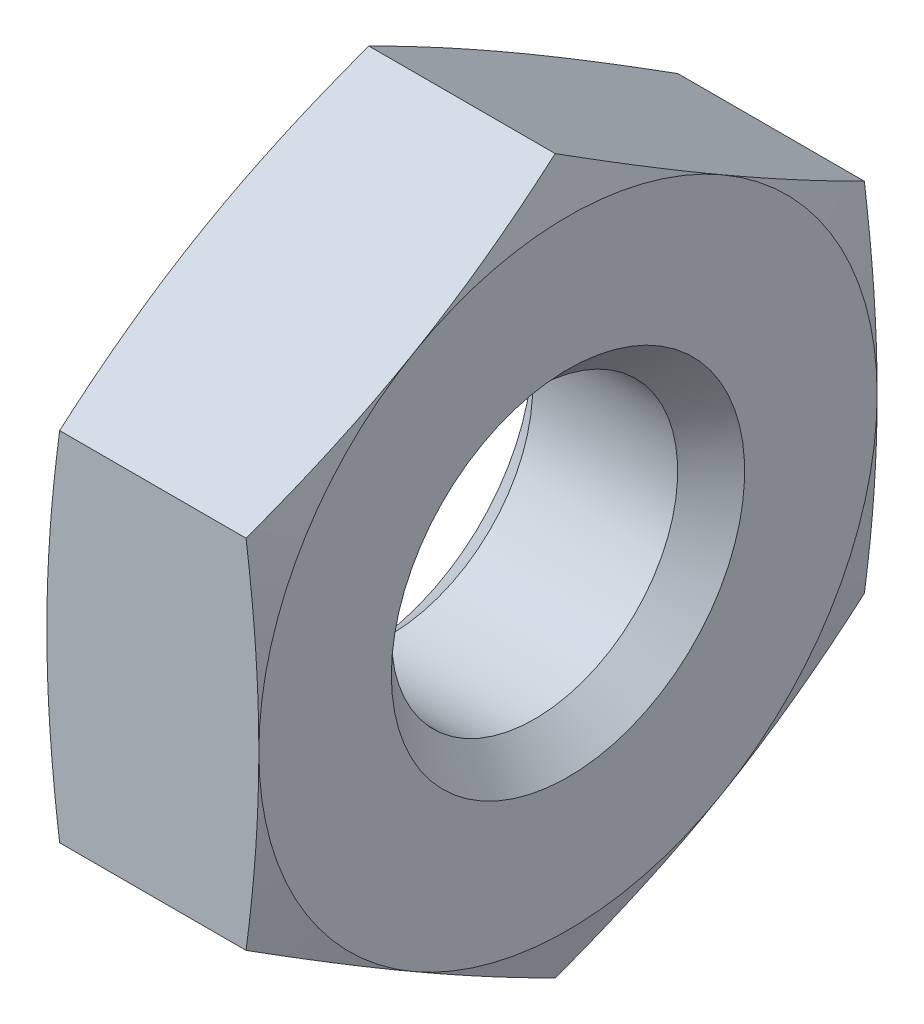
ISO-10303-21;
HEADER;
FILE_DESCRIPTION(('STEP AP214'),'2;1');
FILE_NAME('part.step','',(''),(''),'','','');
FILE_SCHEMA(('AUTOMOTIVE_DESIGN { 1 0 10303 214 1 1 1 1 }'));
ENDSEC;
DATA;
#1=APPLICATION_CONTEXT('core data for automotive mechanical design processes');
#2=APPLICATION_PROTOCOL_DEFINITION('international standard','automotive_design',2000,#1);
#3=PRODUCT_CONTEXT('',#1,'mechanical');
#4=PRODUCT('Part','Part','',(#3));
#5=PRODUCT_RELATED_PRODUCT_CATEGORY('part','',(#4));
#6=PRODUCT_DEFINITION_FORMATION('','',#4);
#7=PRODUCT_DEFINITION_CONTEXT('part definition',#1,'design');
#8=PRODUCT_DEFINITION('design','',#6,#7);
#9=PRODUCT_DEFINITION_SHAPE('','',#8);
#10=(LENGTH_UNIT() NAMED_UNIT(*) SI_UNIT(.MILLI.,.METRE.));
#11=(NAMED_UNIT(*) PLANE_ANGLE_UNIT() SI_UNIT($,.RADIAN.));
#12=(NAMED_UNIT(*) SI_UNIT($,.STERADIAN.) SOLID_ANGLE_UNIT());
#13=UNCERTAINTY_MEASURE_WITH_UNIT(LENGTH_MEASURE(1.E-05),#10,'distance_accuracy_value','');
#14=(GEOMETRIC_REPRESENTATION_CONTEXT(3) GLOBAL_UNCERTAINTY_ASSIGNED_CONTEXT((#13)) GLOBAL_UNIT_ASSIGNED_CONTEXT((#10,
#11,#12)) REPRESENTATION_CONTEXT('',''));
#15=CARTESIAN_POINT('',(0.,0.,0.));
#16=DIRECTION('',(0.,0.,1.));
#17=DIRECTION('',(1.,0.,0.));
#18=AXIS2_PLACEMENT_3D('',#15,#16,#17);
#19=CARTESIAN_POINT('',(0.56269330410532,0.,0.));
#20=DIRECTION('',(1.,0.,0.));
#21=DIRECTION('',(0.,0.,-1.));
#22=AXIS2_PLACEMENT_3D('',#19,#20,#21);
#23=CONICAL_SURFACE('',#22,5.6,1.30899693899576);
#24=CARTESIAN_POINT('',(0.780299643703765,-5.37263958975337,-3.5));
#25=CARTESIAN_POINT('',(0.744589233852441,-5.21354089147475,-3.5));
#26=CARTESIAN_POINT('',(0.70931171891034,-5.05434349000158,-3.5));
#27=CARTESIAN_POINT('',(0.639854512837468,-4.7357025881723,-3.5));
#28=CARTESIAN_POINT('',(0.605674868309391,-4.57625907766958,-3.5));
#29=CARTESIAN_POINT('',(0.538616504644134,-4.25693837005399,-3.5));
#30=CARTESIAN_POINT('',(0.505739058843958,-4.09706090420762,-3.5));
#31=CARTESIAN_POINT('',(0.441642255520401,-3.77697566587975,-3.5));
#32=CARTESIAN_POINT('',(0.410422884277863,-3.61676789614263,-3.5));
#33=CARTESIAN_POINT('',(0.320289794037866,-3.13813038837596,-3.5));
#34=CARTESIAN_POINT('',(0.264352501348318,-2.81912920735306,-3.5));
#35=CARTESIAN_POINT('',(0.164725752535906,-2.17917867835865,-3.5));
#36=CARTESIAN_POINT('',(0.121034389156163,-1.85822964172214,-3.5));
#37=CARTESIAN_POINT('',(0.0688360489092748,-1.37348311973838,-3.5));
#38=CARTESIAN_POINT('',(0.0536120657139549,-1.21041222617409,-3.5));
#39=CARTESIAN_POINT('',(0.0285335735098665,-0.883863304428876,-3.5));
#40=CARTESIAN_POINT('',(0.0186786057338892,-0.720385312232895,-3.5));
#41=CARTESIAN_POINT('',(0.00490910639079482,-0.393247021490619,-3.5));
#42=CARTESIAN_POINT('',(0.000991949787576189,-0.229586835532451,-3.5));
#43=CARTESIAN_POINT('',(-0.000659398074575162,0.0977652182505943,-3.5));
#44=CARTESIAN_POINT('',(0.00160640066889535,0.261457086023815,-3.5));
#45=CARTESIAN_POINT('',(0.0121936851365806,0.589242444677897,-3.5));
#46=CARTESIAN_POINT('',(0.0205373728996883,0.753335203681691,-3.5));
#47=CARTESIAN_POINT('',(0.042802607068227,1.08114336737559,-3.5));
#48=CARTESIAN_POINT('',(0.0567244497324315,1.24485875155857,-3.5));
#49=CARTESIAN_POINT('',(0.0894343457280755,1.57190331408261,-3.5));
#50=CARTESIAN_POINT('',(0.108225572821048,1.73523217016626,-3.5));
#51=CARTESIAN_POINT('',(0.14988952546665,2.06136177234837,-3.5));
#52=CARTESIAN_POINT('',(0.172762262960685,2.22416251690029,-3.5));
#53=CARTESIAN_POINT('',(0.244098460667586,2.69680518103286,-3.5));
#54=CARTESIAN_POINT('',(0.296945384108972,3.00598220329276,-3.5));
#55=CARTESIAN_POINT('',(0.410608014060788,3.62286798465679,-3.5));
#56=CARTESIAN_POINT('',(0.471424812861754,3.93057653650151,-3.5));
#57=CARTESIAN_POINT('',(0.598361739682302,4.5449769629447,-3.5));
#58=CARTESIAN_POINT('',(0.664483309898176,4.85166853729983,-3.5));
#59=CARTESIAN_POINT('',(0.800305731823585,5.46423128981333,-3.5));
#60=CARTESIAN_POINT('',(0.870006357106952,5.77010251858518,-3.5));
#61=CARTESIAN_POINT('',(1.01119361631923,6.3781887984703,-3.5));
#62=CARTESIAN_POINT('',(1.08265523421,6.68040967950566,-3.5));
#63=CARTESIAN_POINT('',(1.22734504817278,7.28443336641159,-3.5));
#64=CARTESIAN_POINT('',(1.30057327884423,7.5862361639713,-3.5));
#65=CARTESIAN_POINT('',(1.44823297801399,8.18913053127256,-3.5));
#66=CARTESIAN_POINT('',(1.52266275764653,8.49022251551592,-3.5));
#67=CARTESIAN_POINT('',(1.67251890048898,9.09214760588233,-3.5));
#68=CARTESIAN_POINT('',(1.74794522949762,9.39298072051422,-3.5));
#69=CARTESIAN_POINT('',(1.82372271347212,9.69372429813112,-3.5));
#70=B_SPLINE_CURVE_WITH_KNOTS('',3,(#24,#25,#26,#27,#28,#29,#30,#31,#32,#33,#34,#35,#36,#37,#38,
#39,#40,#41,#42,#43,#44,#45,#46,#47,#48,#49,#50,#51,#52,#53,#54,#55,#56,#57,#58,#59,#60,#61,#62,
#63,#64,#65,#66,#67,#68,#69),.UNSPECIFIED.,.F.,.F.,(4,2,2,2,2,2,2,2,2,2,2,2,2,2,2,2,2,2,2,2,2,2,
4),(0.,0.489172947297161,0.978366631768828,1.46802741763687,1.95768415134714,2.92915325799205,
3.90047097783945,4.39173716569202,4.88296136964949,5.37396834579562,5.86497452800315,
6.35778336842201,6.85061838565054,7.34377543379909,7.83693392481653,8.77773071120303,
9.7186565711571,10.6598391110541,11.6009621809452,12.5326190767902,13.4642942341462,
14.3947576115645,15.325189138291),.UNSPECIFIED.);
#71=CARTESIAN_POINT('',(0.,0.,-3.5));
#72=VERTEX_POINT('',#71);
#73=CARTESIAN_POINT('',(0.145081595145823,-2.0207259421637,-3.5));
#74=VERTEX_POINT('',#73);
#75=EDGE_CURVE('E317',#72,#74,#70,.F.);
#76=ORIENTED_EDGE('',*,*,#75,.T.);
#77=CARTESIAN_POINT('',(0.145112536579465,-2.02061047210986,-3.5002));
#78=CARTESIAN_POINT('',(0.122614406177981,-2.10453570366723,-3.35483723490565));
#79=CARTESIAN_POINT('',(0.102189745494018,-2.18861311055533,-3.20921089440683));
#80=CARTESIAN_POINT('',(0.0663054466052625,-2.3570648771636,-2.91744387601656));
#81=CARTESIAN_POINT('',(0.0508478254944734,-2.44143934349253,-2.77130301347336));
#82=CARTESIAN_POINT('',(0.0258000877464164,-2.60997361780492,-2.47939308754755));
#83=CARTESIAN_POINT('',(0.0161800979095206,-2.69413228593379,-2.33362599845102));
#84=CARTESIAN_POINT('',(0.00328066753314114,-2.86255695641053,-2.04190591193726));
#85=CARTESIAN_POINT('',(0.,-2.94682293482804,-1.89595295596863));
#86=CARTESIAN_POINT('',(0.,-3.11535489166306,-1.60404704403137));
#87=CARTESIAN_POINT('',(0.00328066753314201,-3.19962087008057,-1.45809408806274));
#88=CARTESIAN_POINT('',(0.0161800979095222,-3.36804554055732,-1.16637400154898));
#89=CARTESIAN_POINT('',(0.0258000877464183,-3.45220420868619,-1.02060691245244));
#90=CARTESIAN_POINT('',(0.0508478254944761,-3.62073848299858,-0.728696986526635));
#91=CARTESIAN_POINT('',(0.0663054466052656,-3.7051129493275,-0.582556123983437));
#92=CARTESIAN_POINT('',(0.102189745494022,-3.87356471593577,-0.290789105593172));
#93=CARTESIAN_POINT('',(0.122614406177985,-3.95764212282387,-0.145162765094345));
#94=CARTESIAN_POINT('',(0.145112536579469,-4.04156735438124,0.000200000000001217));
#95=B_SPLINE_CURVE_WITH_KNOTS('',3,(#77,#78,#79,#80,#81,#82,#83,#84,#85,#86,#87,#88,#89,#90,#91,
#92,#93,#94),.UNSPECIFIED.,.F.,.F.,(4,2,2,2,2,2,2,2,4),(0.,0.508081243376834,1.016368556428,
1.52203235492776,2.02759827097034,2.53316418701292,3.03882798551268,3.54711529856384,
4.05519654194068),.UNSPECIFIED.);
#96=CARTESIAN_POINT('',(0.,-3.03108891324554,-1.75000000000001));
#97=VERTEX_POINT('',#96);
#98=EDGE_CURVE('E328',#74,#97,#95,.T.);
#99=ORIENTED_EDGE('',*,*,#98,.T.);
#100=CARTESIAN_POINT('',(0.,0.,0.));
#101=DIRECTION('',(-1.,0.,0.));
#102=DIRECTION('',(0.,0.,1.));
#103=AXIS2_PLACEMENT_3D('',#100,#101,#102);
#104=CIRCLE('',#103,3.5);
#105=EDGE_CURVE('E165',#72,#97,#104,.T.);
#106=ORIENTED_EDGE('',*,*,#105,.F.);
#107=EDGE_LOOP('',(#76,#99,#106));
#108=FACE_BOUND('',#107,.T.);
#109=ADVANCED_FACE('F36',(#108),#23,.T.);
#110=CARTESIAN_POINT('',(0.,-3.03108891324554,1.75000000000001));
#111=VERTEX_POINT('',#110);
#112=EDGE_CURVE('E163',#97,#111,#104,.T.);
#113=ORIENTED_EDGE('',*,*,#112,.F.);
#114=CARTESIAN_POINT('',(0.145081595145827,-4.0414518843274,0.));
#115=VERTEX_POINT('',#114);
#116=EDGE_CURVE('E323',#97,#115,#95,.T.);
#117=ORIENTED_EDGE('',*,*,#116,.T.);
#118=CARTESIAN_POINT('',(0.145112536579469,-4.04156735438124,-0.0002));
#119=CARTESIAN_POINT('',(0.122614406177985,-3.95764212282387,0.145162765094346));
#120=CARTESIAN_POINT('',(0.102189745494022,-3.87356471593577,0.290789105593173));
#121=CARTESIAN_POINT('',(0.0663054466052655,-3.7051129493275,0.582556123983438));
#122=CARTESIAN_POINT('',(0.0508478254944761,-3.62073848299858,0.728696986526637));
#123=CARTESIAN_POINT('',(0.0258000877464184,-3.45220420868619,1.02060691245245));
#124=CARTESIAN_POINT('',(0.0161800979095222,-3.36804554055731,1.16637400154898));
#125=CARTESIAN_POINT('',(0.00328066753314192,-3.19962087008057,1.45809408806274));
#126=CARTESIAN_POINT('',(0.,-3.11535489166306,1.60404704403137));
#127=CARTESIAN_POINT('',(0.,-2.94682293482804,1.89595295596863));
#128=CARTESIAN_POINT('',(0.00328066753314115,-2.86255695641053,2.04190591193726));
#129=CARTESIAN_POINT('',(0.0161800979095206,-2.69413228593379,2.33362599845102));
#130=CARTESIAN_POINT('',(0.0258000877464164,-2.60997361780492,2.47939308754755));
#131=CARTESIAN_POINT('',(0.0508478254944735,-2.44143934349253,2.77130301347336));
#132=CARTESIAN_POINT('',(0.0663054466052626,-2.3570648771636,2.91744387601656));
#133=CARTESIAN_POINT('',(0.102189745494018,-2.18861311055533,3.20921089440683));
#134=CARTESIAN_POINT('',(0.122614406177981,-2.10453570366723,3.35483723490565));
#135=CARTESIAN_POINT('',(0.145112536579465,-2.02061047210986,3.5002));
#136=B_SPLINE_CURVE_WITH_KNOTS('',3,(#118,#119,#120,#121,#122,#123,#124,#125,#126,#127,#128,
#129,#130,#131,#132,#133,#134,#135),.UNSPECIFIED.,.F.,.F.,(4,2,2,2,2,2,2,2,4),(0.,
0.508081243376833,1.016368556428,1.52203235492776,2.02759827097034,2.53316418701292,
3.03882798551268,3.54711529856384,4.05519654194068),.UNSPECIFIED.);
#137=EDGE_CURVE('E189',#115,#111,#136,.T.);
#138=ORIENTED_EDGE('',*,*,#137,.T.);
#139=EDGE_LOOP('',(#113,#117,#138));
#140=FACE_BOUND('',#139,.T.);
#141=ADVANCED_FACE('F341',(#140),#23,.T.);
#142=CARTESIAN_POINT('',(0.,0.,3.5));
#143=VERTEX_POINT('',#142);
#144=EDGE_CURVE('E157',#111,#143,#104,.T.);
#145=ORIENTED_EDGE('',*,*,#144,.F.);
#146=CARTESIAN_POINT('',(0.145081595145823,-2.0207259421637,3.5));
#147=VERTEX_POINT('',#146);
#148=EDGE_CURVE('E190',#111,#147,#136,.T.);
#149=ORIENTED_EDGE('',*,*,#148,.T.);
#150=CARTESIAN_POINT('',(0.780299643703765,-5.37263958975337,3.5));
#151=CARTESIAN_POINT('',(0.744589233852441,-5.21354089147475,3.5));
#152=CARTESIAN_POINT('',(0.70931171891034,-5.05434349000158,3.5));
#153=CARTESIAN_POINT('',(0.639854512837468,-4.7357025881723,3.5));
#154=CARTESIAN_POINT('',(0.605674868309391,-4.57625907766958,3.5));
#155=CARTESIAN_POINT('',(0.538616504644134,-4.25693837005399,3.5));
#156=CARTESIAN_POINT('',(0.505739058843958,-4.09706090420762,3.5));
#157=CARTESIAN_POINT('',(0.441642255520401,-3.77697566587975,3.5));
#158=CARTESIAN_POINT('',(0.410422884277863,-3.61676789614263,3.5));
#159=CARTESIAN_POINT('',(0.320289794037866,-3.13813038837596,3.5));
#160=CARTESIAN_POINT('',(0.264352501348318,-2.81912920735306,3.5));
#161=CARTESIAN_POINT('',(0.164725752535906,-2.17917867835865,3.5));
#162=CARTESIAN_POINT('',(0.121034389156163,-1.85822964172214,3.5));
#163=CARTESIAN_POINT('',(0.0688360489092748,-1.37348311973838,3.5));
#164=CARTESIAN_POINT('',(0.0536120657139549,-1.21041222617409,3.5));
#165=CARTESIAN_POINT('',(0.0285335735098665,-0.883863304428876,3.5));
#166=CARTESIAN_POINT('',(0.0186786057338892,-0.720385312232895,3.5));
#167=CARTESIAN_POINT('',(0.00490910639079482,-0.393247021490619,3.5));
#168=CARTESIAN_POINT('',(0.000991949787576189,-0.229586835532451,3.5));
#169=CARTESIAN_POINT('',(-0.000659398074575162,0.0977652182505943,3.5));
#170=CARTESIAN_POINT('',(0.00160640066889535,0.261457086023815,3.5));
#171=CARTESIAN_POINT('',(0.0121936851365806,0.589242444677897,3.5));
#172=CARTESIAN_POINT('',(0.0205373728996883,0.753335203681691,3.5));
#173=CARTESIAN_POINT('',(0.042802607068227,1.08114336737559,3.5));
#174=CARTESIAN_POINT('',(0.0567244497324315,1.24485875155857,3.5));
#175=CARTESIAN_POINT('',(0.0894343457280755,1.57190331408261,3.5));
#176=CARTESIAN_POINT('',(0.108225572821048,1.73523217016626,3.5));
#177=CARTESIAN_POINT('',(0.14988952546665,2.06136177234837,3.5));
#178=CARTESIAN_POINT('',(0.172762262960685,2.22416251690029,3.5));
#179=CARTESIAN_POINT('',(0.244098460667586,2.69680518103286,3.5));
#180=CARTESIAN_POINT('',(0.296945384108972,3.00598220329276,3.5));
#181=CARTESIAN_POINT('',(0.410608014060788,3.62286798465679,3.5));
#182=CARTESIAN_POINT('',(0.471424812861754,3.93057653650151,3.5));
#183=CARTESIAN_POINT('',(0.598361739682302,4.5449769629447,3.5));
#184=CARTESIAN_POINT('',(0.664483309898176,4.85166853729983,3.5));
#185=CARTESIAN_POINT('',(0.800305731823585,5.46423128981333,3.5));
#186=CARTESIAN_POINT('',(0.870006357106952,5.77010251858518,3.5));
#187=CARTESIAN_POINT('',(1.01119361631923,6.3781887984703,3.5));
#188=CARTESIAN_POINT('',(1.08265523421,6.68040967950566,3.5));
#189=CARTESIAN_POINT('',(1.22734504817278,7.28443336641159,3.5));
#190=CARTESIAN_POINT('',(1.30057327884423,7.5862361639713,3.5));
#191=CARTESIAN_POINT('',(1.44823297801399,8.18913053127256,3.5));
#192=CARTESIAN_POINT('',(1.52266275764653,8.49022251551592,3.5));
#193=CARTESIAN_POINT('',(1.67251890048898,9.09214760588233,3.5));
#194=CARTESIAN_POINT('',(1.74794522949762,9.39298072051422,3.5));
#195=CARTESIAN_POINT('',(1.82372271347212,9.69372429813112,3.5));
#196=B_SPLINE_CURVE_WITH_KNOTS('',3,(#150,#151,#152,#153,#154,#155,#156,#157,#158,#159,#160,
#161,#162,#163,#164,#165,#166,#167,#168,#169,#170,#171,#172,#173,#174,#175,#176,#177,#178,#179,
#180,#181,#182,#183,#184,#185,#186,#187,#188,#189,#190,#191,#192,#193,#194,#195),.UNSPECIFIED.,
.F.,.F.,(4,2,2,2,2,2,2,2,2,2,2,2,2,2,2,2,2,2,2,2,2,2,4),(0.,0.489172947297161,0.978366631768828,
1.46802741763687,1.95768415134714,2.92915325799205,3.90047097783945,4.39173716569202,
4.88296136964949,5.37396834579562,5.86497452800315,6.35778336842201,6.85061838565054,
7.34377543379909,7.83693392481653,8.77773071120303,9.7186565711571,10.6598391110541,
11.6009621809452,12.5326190767902,13.4642942341462,14.3947576115645,15.325189138291),.UNSPECIFIED.);
#197=EDGE_CURVE('E188',#147,#143,#196,.T.);
#198=ORIENTED_EDGE('',*,*,#197,.T.);
#199=EDGE_LOOP('',(#145,#149,#198));
#200=FACE_BOUND('',#199,.T.);
#201=ADVANCED_FACE('F282',(#200),#23,.T.);
#202=CARTESIAN_POINT('',(0.145112536579469,4.04156735438124,0.0002));
#203=CARTESIAN_POINT('',(0.122614406177985,3.95764212282387,-0.145162765094346));
#204=CARTESIAN_POINT('',(0.102189745494022,3.87356471593577,-0.290789105593173));
#205=CARTESIAN_POINT('',(0.0663054466052655,3.7051129493275,-0.582556123983438));
#206=CARTESIAN_POINT('',(0.0508478254944761,3.62073848299858,-0.728696986526637));
#207=CARTESIAN_POINT('',(0.0258000877464184,3.45220420868619,-1.02060691245245));
#208=CARTESIAN_POINT('',(0.0161800979095222,3.36804554055731,-1.16637400154898));
#209=CARTESIAN_POINT('',(0.00328066753314192,3.19962087008057,-1.45809408806274));
#210=CARTESIAN_POINT('',(0.,3.11535489166306,-1.60404704403137));
#211=CARTESIAN_POINT('',(0.,2.94682293482804,-1.89595295596863));
#212=CARTESIAN_POINT('',(0.00328066753314115,2.86255695641053,-2.04190591193726));
#213=CARTESIAN_POINT('',(0.0161800979095206,2.69413228593379,-2.33362599845102));
#214=CARTESIAN_POINT('',(0.0258000877464164,2.60997361780492,-2.47939308754755));
#215=CARTESIAN_POINT('',(0.0508478254944735,2.44143934349253,-2.77130301347336));
#216=CARTESIAN_POINT('',(0.0663054466052626,2.3570648771636,-2.91744387601656));
#217=CARTESIAN_POINT('',(0.102189745494018,2.18861311055533,-3.20921089440683));
#218=CARTESIAN_POINT('',(0.122614406177981,2.10453570366723,-3.35483723490565));
#219=CARTESIAN_POINT('',(0.145112536579465,2.02061047210986,-3.5002));
#220=B_SPLINE_CURVE_WITH_KNOTS('',3,(#202,#203,#204,#205,#206,#207,#208,#209,#210,#211,#212,
#213,#214,#215,#216,#217,#218,#219),.UNSPECIFIED.,.F.,.F.,(4,2,2,2,2,2,2,2,4),(0.,
0.508081243376833,1.016368556428,1.52203235492776,2.02759827097034,2.53316418701292,
3.03882798551268,3.54711529856384,4.05519654194068),.UNSPECIFIED.);
#221=CARTESIAN_POINT('',(0.,3.03108891324554,-1.75000000000001));
#222=VERTEX_POINT('',#221);
#223=CARTESIAN_POINT('',(0.145081595145823,2.0207259421637,-3.5));
#224=VERTEX_POINT('',#223);
#225=EDGE_CURVE('E144',#222,#224,#220,.T.);
#226=ORIENTED_EDGE('',*,*,#225,.T.);
#227=EDGE_CURVE('E322',#224,#72,#70,.F.);
#228=ORIENTED_EDGE('',*,*,#227,.T.);
#229=EDGE_CURVE('E151',#222,#72,#104,.T.);
#230=ORIENTED_EDGE('',*,*,#229,.F.);
#231=EDGE_LOOP('',(#226,#228,#230));
#232=FACE_BOUND('',#231,.T.);
#233=ADVANCED_FACE('F336',(#232),#23,.T.);
#234=CARTESIAN_POINT('',(0.,3.03108891324554,1.75000000000001));
#235=VERTEX_POINT('',#234);
#236=EDGE_CURVE('E142',#143,#235,#104,.T.);
#237=ORIENTED_EDGE('',*,*,#236,.F.);
#238=CARTESIAN_POINT('',(0.145081595145823,2.0207259421637,3.5));
#239=VERTEX_POINT('',#238);
#240=EDGE_CURVE('E143',#143,#239,#196,.T.);
#241=ORIENTED_EDGE('',*,*,#240,.T.);
#242=CARTESIAN_POINT('',(0.145112536579465,2.02061047210986,3.5002));
#243=CARTESIAN_POINT('',(0.122614406177981,2.10453570366723,3.35483723490565));
#244=CARTESIAN_POINT('',(0.102189745494018,2.18861311055533,3.20921089440683));
#245=CARTESIAN_POINT('',(0.0663054466052625,2.3570648771636,2.91744387601656));
#246=CARTESIAN_POINT('',(0.0508478254944734,2.44143934349253,2.77130301347336));
#247=CARTESIAN_POINT('',(0.0258000877464164,2.60997361780492,2.47939308754755));
#248=CARTESIAN_POINT('',(0.0161800979095206,2.69413228593379,2.33362599845102));
#249=CARTESIAN_POINT('',(0.00328066753314114,2.86255695641053,2.04190591193726));
#250=CARTESIAN_POINT('',(0.,2.94682293482804,1.89595295596863));
#251=CARTESIAN_POINT('',(0.,3.11535489166306,1.60404704403137));
#252=CARTESIAN_POINT('',(0.00328066753314201,3.19962087008057,1.45809408806274));
#253=CARTESIAN_POINT('',(0.0161800979095222,3.36804554055732,1.16637400154898));
#254=CARTESIAN_POINT('',(0.0258000877464183,3.45220420868619,1.02060691245244));
#255=CARTESIAN_POINT('',(0.0508478254944761,3.62073848299858,0.728696986526635));
#256=CARTESIAN_POINT('',(0.0663054466052656,3.7051129493275,0.582556123983437));
#257=CARTESIAN_POINT('',(0.102189745494022,3.87356471593577,0.290789105593172));
#258=CARTESIAN_POINT('',(0.122614406177985,3.95764212282387,0.145162765094345));
#259=CARTESIAN_POINT('',(0.145112536579469,4.04156735438124,-0.000200000000001217));
#260=B_SPLINE_CURVE_WITH_KNOTS('',3,(#242,#243,#244,#245,#246,#247,#248,#249,#250,#251,#252,
#253,#254,#255,#256,#257,#258,#259),.UNSPECIFIED.,.F.,.F.,(4,2,2,2,2,2,2,2,4),(0.,
0.508081243376834,1.016368556428,1.52203235492776,2.02759827097034,2.53316418701292,
3.03882798551268,3.54711529856384,4.05519654194068),.UNSPECIFIED.);
#261=EDGE_CURVE('E131',#239,#235,#260,.T.);
#262=ORIENTED_EDGE('',*,*,#261,.T.);
#263=EDGE_LOOP('',(#237,#241,#262));
#264=FACE_BOUND('',#263,.T.);
#265=ADVANCED_FACE('F140',(#264),#23,.T.);
#266=CARTESIAN_POINT('',(2.4,0.,0.));
#267=DIRECTION('',(-1.,0.,0.));
#268=DIRECTION('',(0.,0.,1.));
#269=AXIS2_PLACEMENT_3D('',#266,#267,#268);
#270=CONICAL_SURFACE('',#269,3.4999999999999,1.30899693899574);
#271=CARTESIAN_POINT('',(2.25488746342049,4.04156735438124,-0.000200000000000077));
#272=CARTESIAN_POINT('',(2.27738559382198,3.95764212282387,0.145162765094346));
#273=CARTESIAN_POINT('',(2.29781025450594,3.87356471593577,0.290789105593173));
#274=CARTESIAN_POINT('',(2.3336945533947,3.7051129493275,0.582556123983438));
#275=CARTESIAN_POINT('',(2.34915217450549,3.62073848299858,0.728696986526636));
#276=CARTESIAN_POINT('',(2.37419991225355,3.45220420868618,1.02060691245245));
#277=CARTESIAN_POINT('',(2.38381990209045,3.36804554055731,1.16637400154898));
#278=CARTESIAN_POINT('',(2.39671933246683,3.19962087008057,1.45809408806274));
#279=CARTESIAN_POINT('',(2.39999999999997,3.11535489166306,1.60404704403137));
#280=CARTESIAN_POINT('',(2.39999999999997,2.94682293482804,1.89595295596863));
#281=CARTESIAN_POINT('',(2.39671933246683,2.86255695641053,2.04190591193726));
#282=CARTESIAN_POINT('',(2.38381990209045,2.69413228593379,2.33362599845102));
#283=CARTESIAN_POINT('',(2.37419991225355,2.60997361780491,2.47939308754756));
#284=CARTESIAN_POINT('',(2.34915217450549,2.44143934349252,2.77130301347336));
#285=CARTESIAN_POINT('',(2.3336945533947,2.3570648771636,2.91744387601656));
#286=CARTESIAN_POINT('',(2.29781025450594,2.18861311055533,3.20921089440683));
#287=CARTESIAN_POINT('',(2.27738559382198,2.10453570366723,3.35483723490565));
#288=CARTESIAN_POINT('',(2.25488746342049,2.02061047210986,3.5002));
#289=B_SPLINE_CURVE_WITH_KNOTS('',3,(#271,#272,#273,#274,#275,#276,#277,#278,#279,#280,#281,
#282,#283,#284,#285,#286,#287,#288),.UNSPECIFIED.,.F.,.F.,(4,2,2,2,2,2,2,2,4),(0.,
0.508081243376834,1.016368556428,1.52203235492776,2.02759827097034,2.53316418701292,
3.03882798551268,3.54711529856385,4.05519654194068),.UNSPECIFIED.);
#290=CARTESIAN_POINT('',(2.4,3.03108891324554,1.75000000000001));
#291=VERTEX_POINT('',#290);
#292=CARTESIAN_POINT('',(2.25491840485414,2.0207259421637,3.5));
#293=VERTEX_POINT('',#292);
#294=EDGE_CURVE('E158',#291,#293,#289,.T.);
#295=ORIENTED_EDGE('',*,*,#294,.T.);
#296=CARTESIAN_POINT('',(1.61970035629613,-5.37263958975338,3.5));
#297=CARTESIAN_POINT('',(1.65541076614746,-5.21354089147475,3.5));
#298=CARTESIAN_POINT('',(1.69068828108957,-5.05434349000158,3.5));
#299=CARTESIAN_POINT('',(1.76014548716244,-4.7357025881723,3.5));
#300=CARTESIAN_POINT('',(1.79432513169052,-4.57625907766959,3.5));
#301=CARTESIAN_POINT('',(1.86138349535579,-4.256938370054,3.5));
#302=CARTESIAN_POINT('',(1.89426094115597,-4.09706090420763,3.5));
#303=CARTESIAN_POINT('',(1.95835774447953,-3.77697566587975,3.5));
#304=CARTESIAN_POINT('',(1.98957711572207,-3.61676789614263,3.5));
#305=CARTESIAN_POINT('',(2.07971020596208,-3.13813038837596,3.5));
#306=CARTESIAN_POINT('',(2.13564749865163,-2.81912920735306,3.5));
#307=CARTESIAN_POINT('',(2.23527424746405,-2.17917867835866,3.5));
#308=CARTESIAN_POINT('',(2.2789656108438,-1.85822964172214,3.5));
#309=CARTESIAN_POINT('',(2.33116395109069,-1.37348311973838,3.5));
#310=CARTESIAN_POINT('',(2.34638793428601,-1.21041222617409,3.5));
#311=CARTESIAN_POINT('',(2.3714664264901,-0.883863304428875,3.5));
#312=CARTESIAN_POINT('',(2.38132139426608,-0.720385312232893,3.5));
#313=CARTESIAN_POINT('',(2.39509089360918,-0.393247021490615,3.5));
#314=CARTESIAN_POINT('',(2.3990080502124,-0.229586835532447,3.5));
#315=CARTESIAN_POINT('',(2.40065939807455,0.0977652182506,3.5));
#316=CARTESIAN_POINT('',(2.39839359933108,0.261457086023822,3.5));
#317=CARTESIAN_POINT('',(2.38780631486339,0.589242444677904,3.5));
#318=CARTESIAN_POINT('',(2.37946262710028,0.7533352036817,3.5));
#319=CARTESIAN_POINT('',(2.35719739293174,1.0811433673756,3.5));
#320=CARTESIAN_POINT('',(2.34327555026753,1.24485875155858,3.5));
#321=CARTESIAN_POINT('',(2.31056565427189,1.57190331408262,3.5));
#322=CARTESIAN_POINT('',(2.29177442717891,1.73523217016627,3.5));
#323=CARTESIAN_POINT('',(2.25011047453331,2.06136177234838,3.5));
#324=CARTESIAN_POINT('',(2.22723773703927,2.22416251690031,3.5));
#325=CARTESIAN_POINT('',(2.15590153933236,2.69680518103288,3.5));
#326=CARTESIAN_POINT('',(2.10305461589097,3.00598220329278,3.5));
#327=CARTESIAN_POINT('',(1.98939198593914,3.62286798465682,3.5));
#328=CARTESIAN_POINT('',(1.92857518713817,3.93057653650154,3.5));
#329=CARTESIAN_POINT('',(1.80163826031761,4.54497696294473,3.5));
#330=CARTESIAN_POINT('',(1.73551669010173,4.85166853729986,3.5));
#331=CARTESIAN_POINT('',(1.5996942681763,5.46423128981337,3.5));
#332=CARTESIAN_POINT('',(1.52999364289293,5.77010251858522,3.5));
#333=CARTESIAN_POINT('',(1.38880638368063,6.37818879847034,3.5));
#334=CARTESIAN_POINT('',(1.31734476578986,6.6804096795057,3.5));
#335=CARTESIAN_POINT('',(1.17265495182707,7.28443336641163,3.5));
#336=CARTESIAN_POINT('',(1.09942672115561,7.58623616397134,3.5));
#337=CARTESIAN_POINT('',(0.951767021985841,8.1891305312726,3.5));
#338=CARTESIAN_POINT('',(0.877337242353289,8.49022251551596,3.5));
#339=CARTESIAN_POINT('',(0.727481099510823,9.09214760588237,3.5));
#340=CARTESIAN_POINT('',(0.652054770502175,9.39298072051425,3.5));
#341=CARTESIAN_POINT('',(0.57627728652767,9.69372429813116,3.5));
#342=B_SPLINE_CURVE_WITH_KNOTS('',3,(#296,#297,#298,#299,#300,#301,#302,#303,#304,#305,#306,
#307,#308,#309,#310,#311,#312,#313,#314,#315,#316,#317,#318,#319,#320,#321,#322,#323,#324,#325,
#326,#327,#328,#329,#330,#331,#332,#333,#334,#335,#336,#337,#338,#339,#340,#341),.UNSPECIFIED.,
.F.,.F.,(4,2,2,2,2,2,2,2,2,2,2,2,2,2,2,2,2,2,2,2,2,2,4),(0.,0.489172947297163,0.978366631768833,
1.46802741763688,1.95768415134715,2.92915325799206,3.90047097783947,4.39173716569204,
4.88296136964951,5.37396834579564,5.86497452800318,6.35778336842204,6.85061838565058,
7.34377543379913,7.83693392481656,8.77773071120307,9.71865657115716,10.6598391110541,
11.6009621809452,12.5326190767902,13.4642942341463,14.3947576115646,15.3251891382911),.UNSPECIFIED.);
#343=CARTESIAN_POINT('',(2.4,0.,3.5));
#344=VERTEX_POINT('',#343);
#345=EDGE_CURVE('E11',#293,#344,#342,.F.);
#346=ORIENTED_EDGE('',*,*,#345,.T.);
#347=CARTESIAN_POINT('',(2.4,0.,0.));
#348=DIRECTION('',(-1.,0.,0.));
#349=DIRECTION('',(0.,0.,1.));
#350=AXIS2_PLACEMENT_3D('',#347,#348,#349);
#351=CIRCLE('',#350,3.4999999999999);
#352=EDGE_CURVE('E179',#344,#291,#351,.T.);
#353=ORIENTED_EDGE('',*,*,#352,.T.);
#354=EDGE_LOOP('',(#295,#346,#353));
#355=FACE_BOUND('',#354,.T.);
#356=ADVANCED_FACE('F210',(#355),#270,.T.);
#357=CARTESIAN_POINT('',(2.4,-3.03108891324554,1.75000000000001));
#358=VERTEX_POINT('',#357);
#359=EDGE_CURVE('E183',#358,#344,#351,.T.);
#360=ORIENTED_EDGE('',*,*,#359,.T.);
#361=CARTESIAN_POINT('',(2.25491840485414,-2.0207259421637,3.5));
#362=VERTEX_POINT('',#361);
#363=EDGE_CURVE('E41',#344,#362,#342,.F.);
#364=ORIENTED_EDGE('',*,*,#363,.T.);
#365=CARTESIAN_POINT('',(2.25488746342049,-2.02061047210986,3.5002));
#366=CARTESIAN_POINT('',(2.27738559382198,-2.10453570366723,3.35483723490565));
#367=CARTESIAN_POINT('',(2.29781025450594,-2.18861311055533,3.20921089440683));
#368=CARTESIAN_POINT('',(2.3336945533947,-2.3570648771636,2.91744387601656));
#369=CARTESIAN_POINT('',(2.34915217450549,-2.44143934349253,2.77130301347336));
#370=CARTESIAN_POINT('',(2.37419991225355,-2.60997361780492,2.47939308754755));
#371=CARTESIAN_POINT('',(2.38381990209045,-2.69413228593379,2.33362599845102));
#372=CARTESIAN_POINT('',(2.39671933246683,-2.86255695641053,2.04190591193726));
#373=CARTESIAN_POINT('',(2.39999999999997,-2.94682293482804,1.89595295596863));
#374=CARTESIAN_POINT('',(2.39999999999997,-3.11535489166306,1.60404704403137));
#375=CARTESIAN_POINT('',(2.39671933246683,-3.19962087008057,1.45809408806274));
#376=CARTESIAN_POINT('',(2.38381990209045,-3.36804554055731,1.16637400154898));
#377=CARTESIAN_POINT('',(2.37419991225355,-3.45220420868618,1.02060691245245));
#378=CARTESIAN_POINT('',(2.34915217450549,-3.62073848299858,0.728696986526637));
#379=CARTESIAN_POINT('',(2.3336945533947,-3.7051129493275,0.582556123983438));
#380=CARTESIAN_POINT('',(2.29781025450594,-3.87356471593577,0.290789105593173));
#381=CARTESIAN_POINT('',(2.27738559382198,-3.95764212282387,0.145162765094347));
#382=CARTESIAN_POINT('',(2.25488746342049,-4.04156735438124,-0.000199999999999491));
#383=B_SPLINE_CURVE_WITH_KNOTS('',3,(#365,#366,#367,#368,#369,#370,#371,#372,#373,#374,#375,
#376,#377,#378,#379,#380,#381,#382),.UNSPECIFIED.,.F.,.F.,(4,2,2,2,2,2,2,2,4),(0.,
0.508081243376834,1.016368556428,1.52203235492776,2.02759827097034,2.53316418701292,
3.03882798551268,3.54711529856385,4.05519654194068),.UNSPECIFIED.);
#384=EDGE_CURVE('E244',#362,#358,#383,.T.);
#385=ORIENTED_EDGE('',*,*,#384,.T.);
#386=EDGE_LOOP('',(#360,#364,#385));
#387=FACE_BOUND('',#386,.T.);
#388=ADVANCED_FACE('F276',(#387),#270,.T.);
#389=CARTESIAN_POINT('',(2.4,-3.03108891324554,-1.75000000000001));
#390=VERTEX_POINT('',#389);
#391=EDGE_CURVE('E277',#390,#358,#351,.T.);
#392=ORIENTED_EDGE('',*,*,#391,.T.);
#393=CARTESIAN_POINT('',(2.25491840485413,-4.0414518843274,0.));
#394=VERTEX_POINT('',#393);
#395=EDGE_CURVE('E239',#358,#394,#383,.T.);
#396=ORIENTED_EDGE('',*,*,#395,.T.);
#397=CARTESIAN_POINT('',(2.25488746342049,-4.04156735438124,0.000200000000000077));
#398=CARTESIAN_POINT('',(2.27738559382198,-3.95764212282387,-0.145162765094346));
#399=CARTESIAN_POINT('',(2.29781025450594,-3.87356471593577,-0.290789105593173));
#400=CARTESIAN_POINT('',(2.3336945533947,-3.7051129493275,-0.582556123983438));
#401=CARTESIAN_POINT('',(2.34915217450549,-3.62073848299858,-0.728696986526636));
#402=CARTESIAN_POINT('',(2.37419991225355,-3.45220420868618,-1.02060691245245));
#403=CARTESIAN_POINT('',(2.38381990209045,-3.36804554055731,-1.16637400154898));
#404=CARTESIAN_POINT('',(2.39671933246683,-3.19962087008057,-1.45809408806274));
#405=CARTESIAN_POINT('',(2.39999999999997,-3.11535489166306,-1.60404704403137));
#406=CARTESIAN_POINT('',(2.39999999999997,-2.94682293482804,-1.89595295596863));
#407=CARTESIAN_POINT('',(2.39671933246683,-2.86255695641053,-2.04190591193726));
#408=CARTESIAN_POINT('',(2.38381990209045,-2.69413228593379,-2.33362599845102));
#409=CARTESIAN_POINT('',(2.37419991225355,-2.60997361780491,-2.47939308754756));
#410=CARTESIAN_POINT('',(2.34915217450549,-2.44143934349252,-2.77130301347336));
#411=CARTESIAN_POINT('',(2.3336945533947,-2.3570648771636,-2.91744387601656));
#412=CARTESIAN_POINT('',(2.29781025450594,-2.18861311055533,-3.20921089440683));
#413=CARTESIAN_POINT('',(2.27738559382198,-2.10453570366723,-3.35483723490565));
#414=CARTESIAN_POINT('',(2.25488746342049,-2.02061047210986,-3.5002));
#415=B_SPLINE_CURVE_WITH_KNOTS('',3,(#397,#398,#399,#400,#401,#402,#403,#404,#405,#406,#407,
#408,#409,#410,#411,#412,#413,#414),.UNSPECIFIED.,.F.,.F.,(4,2,2,2,2,2,2,2,4),(0.,
0.508081243376834,1.016368556428,1.52203235492776,2.02759827097034,2.53316418701292,
3.03882798551268,3.54711529856385,4.05519654194068),.UNSPECIFIED.);
#416=EDGE_CURVE('E245',#394,#390,#415,.T.);
#417=ORIENTED_EDGE('',*,*,#416,.T.);
#418=EDGE_LOOP('',(#392,#396,#417));
#419=FACE_BOUND('',#418,.T.);
#420=ADVANCED_FACE('F483',(#419),#270,.T.);
#421=CARTESIAN_POINT('',(2.4,0.,-3.5));
#422=VERTEX_POINT('',#421);
#423=EDGE_CURVE('E278',#422,#390,#351,.T.);
#424=ORIENTED_EDGE('',*,*,#423,.T.);
#425=CARTESIAN_POINT('',(2.25491840485414,-2.0207259421637,-3.5));
#426=VERTEX_POINT('',#425);
#427=EDGE_CURVE('E235',#390,#426,#415,.T.);
#428=ORIENTED_EDGE('',*,*,#427,.T.);
#429=CARTESIAN_POINT('',(1.61970035629613,-5.37263958975338,-3.5));
#430=CARTESIAN_POINT('',(1.65541076614746,-5.21354089147475,-3.5));
#431=CARTESIAN_POINT('',(1.69068828108957,-5.05434349000158,-3.5));
#432=CARTESIAN_POINT('',(1.76014548716244,-4.7357025881723,-3.5));
#433=CARTESIAN_POINT('',(1.79432513169052,-4.57625907766959,-3.5));
#434=CARTESIAN_POINT('',(1.86138349535579,-4.256938370054,-3.5));
#435=CARTESIAN_POINT('',(1.89426094115597,-4.09706090420763,-3.5));
#436=CARTESIAN_POINT('',(1.95835774447953,-3.77697566587975,-3.5));
#437=CARTESIAN_POINT('',(1.98957711572207,-3.61676789614263,-3.5));
#438=CARTESIAN_POINT('',(2.07971020596208,-3.13813038837596,-3.5));
#439=CARTESIAN_POINT('',(2.13564749865163,-2.81912920735306,-3.5));
#440=CARTESIAN_POINT('',(2.23527424746405,-2.17917867835866,-3.5));
#441=CARTESIAN_POINT('',(2.2789656108438,-1.85822964172214,-3.5));
#442=CARTESIAN_POINT('',(2.33116395109069,-1.37348311973838,-3.5));
#443=CARTESIAN_POINT('',(2.34638793428601,-1.21041222617409,-3.5));
#444=CARTESIAN_POINT('',(2.3714664264901,-0.883863304428875,-3.5));
#445=CARTESIAN_POINT('',(2.38132139426608,-0.720385312232893,-3.5));
#446=CARTESIAN_POINT('',(2.39509089360918,-0.393247021490615,-3.5));
#447=CARTESIAN_POINT('',(2.3990080502124,-0.229586835532447,-3.5));
#448=CARTESIAN_POINT('',(2.40065939807455,0.0977652182506,-3.5));
#449=CARTESIAN_POINT('',(2.39839359933108,0.261457086023822,-3.5));
#450=CARTESIAN_POINT('',(2.38780631486339,0.589242444677904,-3.5));
#451=CARTESIAN_POINT('',(2.37946262710028,0.7533352036817,-3.5));
#452=CARTESIAN_POINT('',(2.35719739293174,1.0811433673756,-3.5));
#453=CARTESIAN_POINT('',(2.34327555026753,1.24485875155858,-3.5));
#454=CARTESIAN_POINT('',(2.31056565427189,1.57190331408262,-3.5));
#455=CARTESIAN_POINT('',(2.29177442717891,1.73523217016627,-3.5));
#456=CARTESIAN_POINT('',(2.25011047453331,2.06136177234838,-3.5));
#457=CARTESIAN_POINT('',(2.22723773703927,2.22416251690031,-3.5));
#458=CARTESIAN_POINT('',(2.15590153933236,2.69680518103288,-3.5));
#459=CARTESIAN_POINT('',(2.10305461589097,3.00598220329278,-3.5));
#460=CARTESIAN_POINT('',(1.98939198593914,3.62286798465682,-3.5));
#461=CARTESIAN_POINT('',(1.92857518713817,3.93057653650154,-3.5));
#462=CARTESIAN_POINT('',(1.80163826031761,4.54497696294473,-3.5));
#463=CARTESIAN_POINT('',(1.73551669010173,4.85166853729986,-3.5));
#464=CARTESIAN_POINT('',(1.5996942681763,5.46423128981337,-3.5));
#465=CARTESIAN_POINT('',(1.52999364289293,5.77010251858522,-3.5));
#466=CARTESIAN_POINT('',(1.38880638368063,6.37818879847034,-3.5));
#467=CARTESIAN_POINT('',(1.31734476578986,6.6804096795057,-3.5));
#468=CARTESIAN_POINT('',(1.17265495182707,7.28443336641163,-3.5));
#469=CARTESIAN_POINT('',(1.09942672115561,7.58623616397134,-3.5));
#470=CARTESIAN_POINT('',(0.951767021985841,8.1891305312726,-3.5));
#471=CARTESIAN_POINT('',(0.877337242353289,8.49022251551596,-3.5));
#472=CARTESIAN_POINT('',(0.727481099510823,9.09214760588237,-3.5));
#473=CARTESIAN_POINT('',(0.652054770502175,9.39298072051425,-3.5));
#474=CARTESIAN_POINT('',(0.57627728652767,9.69372429813116,-3.5));
#475=B_SPLINE_CURVE_WITH_KNOTS('',3,(#429,#430,#431,#432,#433,#434,#435,#436,#437,#438,#439,
#440,#441,#442,#443,#444,#445,#446,#447,#448,#449,#450,#451,#452,#453,#454,#455,#456,#457,#458,
#459,#460,#461,#462,#463,#464,#465,#466,#467,#468,#469,#470,#471,#472,#473,#474),.UNSPECIFIED.,
.F.,.F.,(4,2,2,2,2,2,2,2,2,2,2,2,2,2,2,2,2,2,2,2,2,2,4),(0.,0.489172947297163,0.978366631768833,
1.46802741763688,1.95768415134715,2.92915325799206,3.90047097783947,4.39173716569204,
4.88296136964951,5.37396834579564,5.86497452800318,6.35778336842204,6.85061838565058,
7.34377543379913,7.83693392481656,8.77773071120307,9.71865657115716,10.6598391110541,
11.6009621809452,12.5326190767902,13.4642942341463,14.3947576115646,15.3251891382911),.UNSPECIFIED.);
#476=EDGE_CURVE('E252',#426,#422,#475,.T.);
#477=ORIENTED_EDGE('',*,*,#476,.T.);
#478=EDGE_LOOP('',(#424,#428,#477));
#479=FACE_BOUND('',#478,.T.);
#480=ADVANCED_FACE('F364',(#479),#270,.T.);
#481=CARTESIAN_POINT('',(2.4,3.03108891324554,-1.75000000000001));
#482=VERTEX_POINT('',#481);
#483=EDGE_CURVE('E271',#482,#422,#351,.T.);
#484=ORIENTED_EDGE('',*,*,#483,.T.);
#485=CARTESIAN_POINT('',(2.25491840485414,2.0207259421637,-3.5));
#486=VERTEX_POINT('',#485);
#487=EDGE_CURVE('E229',#422,#486,#475,.T.);
#488=ORIENTED_EDGE('',*,*,#487,.T.);
#489=CARTESIAN_POINT('',(2.25488746342049,2.02061047210986,-3.5002));
#490=CARTESIAN_POINT('',(2.27738559382198,2.10453570366723,-3.35483723490565));
#491=CARTESIAN_POINT('',(2.29781025450594,2.18861311055533,-3.20921089440683));
#492=CARTESIAN_POINT('',(2.3336945533947,2.3570648771636,-2.91744387601656));
#493=CARTESIAN_POINT('',(2.34915217450549,2.44143934349253,-2.77130301347336));
#494=CARTESIAN_POINT('',(2.37419991225355,2.60997361780492,-2.47939308754755));
#495=CARTESIAN_POINT('',(2.38381990209045,2.69413228593379,-2.33362599845102));
#496=CARTESIAN_POINT('',(2.39671933246683,2.86255695641053,-2.04190591193726));
#497=CARTESIAN_POINT('',(2.39999999999997,2.94682293482804,-1.89595295596863));
#498=CARTESIAN_POINT('',(2.39999999999997,3.11535489166306,-1.60404704403137));
#499=CARTESIAN_POINT('',(2.39671933246683,3.19962087008057,-1.45809408806274));
#500=CARTESIAN_POINT('',(2.38381990209045,3.36804554055731,-1.16637400154898));
#501=CARTESIAN_POINT('',(2.37419991225355,3.45220420868618,-1.02060691245245));
#502=CARTESIAN_POINT('',(2.34915217450549,3.62073848299858,-0.728696986526637));
#503=CARTESIAN_POINT('',(2.3336945533947,3.7051129493275,-0.582556123983438));
#504=CARTESIAN_POINT('',(2.29781025450594,3.87356471593577,-0.290789105593173));
#505=CARTESIAN_POINT('',(2.27738559382198,3.95764212282387,-0.145162765094347));
#506=CARTESIAN_POINT('',(2.25488746342049,4.04156735438124,0.000199999999999491));
#507=B_SPLINE_CURVE_WITH_KNOTS('',3,(#489,#490,#491,#492,#493,#494,#495,#496,#497,#498,#499,
#500,#501,#502,#503,#504,#505,#506),.UNSPECIFIED.,.F.,.F.,(4,2,2,2,2,2,2,2,4),(0.,
0.508081243376834,1.016368556428,1.52203235492776,2.02759827097034,2.53316418701292,
3.03882798551268,3.54711529856385,4.05519654194068),.UNSPECIFIED.);
#508=EDGE_CURVE('E258',#486,#482,#507,.T.);
#509=ORIENTED_EDGE('',*,*,#508,.T.);
#510=EDGE_LOOP('',(#484,#488,#509));
#511=FACE_BOUND('',#510,.T.);
#512=ADVANCED_FACE('F211',(#511),#270,.T.);
#513=CARTESIAN_POINT('',(0.145081595145827,4.0414518843274,0.));
#514=VERTEX_POINT('',#513);
#515=EDGE_CURVE('E128',#235,#514,#260,.T.);
#516=ORIENTED_EDGE('',*,*,#515,.T.);
#517=EDGE_CURVE('E147',#514,#222,#220,.T.);
#518=ORIENTED_EDGE('',*,*,#517,.T.);
#519=EDGE_CURVE('E146',#235,#222,#104,.T.);
#520=ORIENTED_EDGE('',*,*,#519,.F.);
#521=EDGE_LOOP('',(#516,#518,#520));
#522=FACE_BOUND('',#521,.T.);
#523=ADVANCED_FACE('F38',(#522),#23,.T.);
#524=CARTESIAN_POINT('',(0.,3.5,0.));
#525=DIRECTION('',(1.,0.,0.));
#526=DIRECTION('',(0.,0.,-1.));
#527=AXIS2_PLACEMENT_3D('',#524,#525,#526);
#528=PLANE('',#527);
#529=CARTESIAN_POINT('',(0.,0.,0.));
#530=DIRECTION('',(-1.,0.,0.));
#531=DIRECTION('',(0.,0.,1.));
#532=AXIS2_PLACEMENT_3D('',#529,#530,#531);
#533=CIRCLE('',#532,2.);
#534=CARTESIAN_POINT('',(0.,0.,2.));
#535=VERTEX_POINT('',#534);
#536=EDGE_CURVE('E164',#535,#535,#533,.T.);
#537=ORIENTED_EDGE('',*,*,#536,.F.);
#538=EDGE_LOOP('',(#537));
#539=FACE_BOUND('',#538,.T.);
#540=ORIENTED_EDGE('',*,*,#236,.T.);
#541=ORIENTED_EDGE('',*,*,#519,.T.);
#542=ORIENTED_EDGE('',*,*,#229,.T.);
#543=ORIENTED_EDGE('',*,*,#105,.T.);
#544=ORIENTED_EDGE('',*,*,#112,.T.);
#545=ORIENTED_EDGE('',*,*,#144,.T.);
#546=EDGE_LOOP('',(#540,#541,#542,#543,#544,#545));
#547=FACE_BOUND('',#546,.T.);
#548=ADVANCED_FACE('F154',(#539,#547),#528,.F.);
#549=CARTESIAN_POINT('',(0.,0.,0.));
#550=DIRECTION('',(-1.,0.,0.));
#551=DIRECTION('',(0.,0.,1.));
#552=AXIS2_PLACEMENT_3D('',#549,#550,#551);
#553=CONICAL_SURFACE('',#552,2.,0.785398163397448);
#554=CARTESIAN_POINT('',(0.379,0.,0.));
#555=DIRECTION('',(-1.,0.,0.));
#556=DIRECTION('',(0.,0.,1.));
#557=AXIS2_PLACEMENT_3D('',#554,#555,#556);
#558=CIRCLE('',#557,1.621);
#559=CARTESIAN_POINT('',(0.379,0.,1.621));
#560=VERTEX_POINT('',#559);
#561=EDGE_CURVE('E167',#560,#560,#558,.T.);
#562=ORIENTED_EDGE('',*,*,#561,.F.);
#563=EDGE_LOOP('',(#562));
#564=FACE_BOUND('',#563,.T.);
#565=ORIENTED_EDGE('',*,*,#536,.T.);
#566=EDGE_LOOP('',(#565));
#567=FACE_BOUND('',#566,.T.);
#568=ADVANCED_FACE('F362',(#564,#567),#553,.F.);
#569=CARTESIAN_POINT('',(2.4,0.,0.));
#570=DIRECTION('',(-1.,0.,0.));
#571=DIRECTION('',(0.,0.,1.));
#572=AXIS2_PLACEMENT_3D('',#569,#570,#571);
#573=CYLINDRICAL_SURFACE('',#572,1.621);
#574=CARTESIAN_POINT('',(2.021,0.,0.));
#575=DIRECTION('',(-1.,0.,0.));
#576=DIRECTION('',(0.,0.,1.));
#577=AXIS2_PLACEMENT_3D('',#574,#575,#576);
#578=CIRCLE('',#577,1.621);
#579=CARTESIAN_POINT('',(2.021,0.,1.621));
#580=VERTEX_POINT('',#579);
#581=EDGE_CURVE('E171',#580,#580,#578,.T.);
#582=ORIENTED_EDGE('',*,*,#581,.F.);
#583=EDGE_LOOP('',(#582));
#584=FACE_BOUND('',#583,.T.);
#585=ORIENTED_EDGE('',*,*,#561,.T.);
#586=EDGE_LOOP('',(#585));
#587=FACE_BOUND('',#586,.T.);
#588=ADVANCED_FACE('F394',(#584,#587),#573,.F.);
#589=CARTESIAN_POINT('',(2.021,0.,0.));
#590=DIRECTION('',(1.,0.,0.));
#591=DIRECTION('',(0.,0.,-1.));
#592=AXIS2_PLACEMENT_3D('',#589,#590,#591);
#593=CONICAL_SURFACE('',#592,1.621,0.785398163397448);
#594=CARTESIAN_POINT('',(2.4,0.,0.));
#595=DIRECTION('',(-1.,0.,0.));
#596=DIRECTION('',(0.,0.,1.));
#597=AXIS2_PLACEMENT_3D('',#594,#595,#596);
#598=CIRCLE('',#597,2.);
#599=CARTESIAN_POINT('',(2.4,0.,2.));
#600=VERTEX_POINT('',#599);
#601=EDGE_CURVE('E176',#600,#600,#598,.T.);
#602=ORIENTED_EDGE('',*,*,#601,.F.);
#603=EDGE_LOOP('',(#602));
#604=FACE_BOUND('',#603,.T.);
#605=ORIENTED_EDGE('',*,*,#581,.T.);
#606=EDGE_LOOP('',(#605));
#607=FACE_BOUND('',#606,.T.);
#608=ADVANCED_FACE('F389',(#604,#607),#593,.F.);
#609=CARTESIAN_POINT('',(2.4,2.,0.));
#610=DIRECTION('',(-1.,0.,0.));
#611=DIRECTION('',(0.,0.,1.));
#612=AXIS2_PLACEMENT_3D('',#609,#610,#611);
#613=PLANE('',#612);
#614=ORIENTED_EDGE('',*,*,#352,.F.);
#615=ORIENTED_EDGE('',*,*,#359,.F.);
#616=ORIENTED_EDGE('',*,*,#391,.F.);
#617=ORIENTED_EDGE('',*,*,#423,.F.);
#618=ORIENTED_EDGE('',*,*,#483,.F.);
#619=EDGE_CURVE('E182',#291,#482,#351,.T.);
#620=ORIENTED_EDGE('',*,*,#619,.F.);
#621=EDGE_LOOP('',(#614,#615,#616,#617,#618,#620));
#622=FACE_BOUND('',#621,.T.);
#623=ORIENTED_EDGE('',*,*,#601,.T.);
#624=EDGE_LOOP('',(#623));
#625=FACE_BOUND('',#624,.T.);
#626=ADVANCED_FACE('F208',(#622,#625),#613,.F.);
#627=ORIENTED_EDGE('',*,*,#619,.T.);
#628=CARTESIAN_POINT('',(2.25491840485413,4.0414518843274,0.));
#629=VERTEX_POINT('',#628);
#630=EDGE_CURVE('E222',#482,#629,#507,.T.);
#631=ORIENTED_EDGE('',*,*,#630,.T.);
#632=EDGE_CURVE('E160',#629,#291,#289,.T.);
#633=ORIENTED_EDGE('',*,*,#632,.T.);
#634=EDGE_LOOP('',(#627,#631,#633));
#635=FACE_BOUND('',#634,.T.);
#636=ADVANCED_FACE('F200',(#635),#270,.T.);
#637=CARTESIAN_POINT('',(2.4,2.0207259421637,3.5));
#638=DIRECTION('',(0.,0.,-1.));
#639=DIRECTION('',(-1.,0.,0.));
#640=AXIS2_PLACEMENT_3D('',#637,#638,#639);
#641=PLANE('',#640);
#642=DIRECTION('',(-1.,0.,0.));
#643=VECTOR('',#642,1.);
#644=CARTESIAN_POINT('',(2.4,-2.0207259421637,3.5));
#645=LINE('',#644,#643);
#646=EDGE_CURVE('E135',#362,#147,#645,.T.);
#647=ORIENTED_EDGE('',*,*,#646,.F.);
#648=ORIENTED_EDGE('',*,*,#363,.F.);
#649=ORIENTED_EDGE('',*,*,#345,.F.);
#650=DIRECTION('',(-1.,0.,0.));
#651=VECTOR('',#650,1.);
#652=CARTESIAN_POINT('',(2.4,2.0207259421637,3.5));
#653=LINE('',#652,#651);
#654=EDGE_CURVE('E64',#293,#239,#653,.T.);
#655=ORIENTED_EDGE('',*,*,#654,.T.);
#656=ORIENTED_EDGE('',*,*,#240,.F.);
#657=ORIENTED_EDGE('',*,*,#197,.F.);
#658=EDGE_LOOP('',(#647,#648,#649,#655,#656,#657));
#659=FACE_BOUND('',#658,.T.);
#660=ADVANCED_FACE('F196',(#659),#641,.F.);
#661=CARTESIAN_POINT('',(2.4,-2.0207259421637,3.5));
#662=DIRECTION('',(0.,0.866025403784437,-0.500000000000002));
#663=DIRECTION('',(0.,0.500000000000002,0.866025403784438));
#664=AXIS2_PLACEMENT_3D('',#661,#662,#663);
#665=PLANE('',#664);
#666=DIRECTION('',(-1.,0.,0.));
#667=VECTOR('',#666,1.);
#668=CARTESIAN_POINT('',(2.4,-4.0414518843274,0.));
#669=LINE('',#668,#667);
#670=EDGE_CURVE('E288',#394,#115,#669,.T.);
#671=ORIENTED_EDGE('',*,*,#670,.F.);
#672=ORIENTED_EDGE('',*,*,#395,.F.);
#673=ORIENTED_EDGE('',*,*,#384,.F.);
#674=ORIENTED_EDGE('',*,*,#646,.T.);
#675=ORIENTED_EDGE('',*,*,#148,.F.);
#676=ORIENTED_EDGE('',*,*,#137,.F.);
#677=EDGE_LOOP('',(#671,#672,#673,#674,#675,#676));
#678=FACE_BOUND('',#677,.T.);
#679=ADVANCED_FACE('F199',(#678),#665,.F.);
#680=CARTESIAN_POINT('',(2.4,-4.0414518843274,0.));
#681=DIRECTION('',(0.,0.866025403784437,0.500000000000002));
#682=DIRECTION('',(0.,-0.500000000000002,0.866025403784438));
#683=AXIS2_PLACEMENT_3D('',#680,#681,#682);
#684=PLANE('',#683);
#685=DIRECTION('',(-1.,0.,0.));
#686=VECTOR('',#685,1.);
#687=CARTESIAN_POINT('',(2.4,-2.0207259421637,-3.5));
#688=LINE('',#687,#686);
#689=EDGE_CURVE('E291',#426,#74,#688,.T.);
#690=ORIENTED_EDGE('',*,*,#689,.F.);
#691=ORIENTED_EDGE('',*,*,#427,.F.);
#692=ORIENTED_EDGE('',*,*,#416,.F.);
#693=ORIENTED_EDGE('',*,*,#670,.T.);
#694=ORIENTED_EDGE('',*,*,#116,.F.);
#695=ORIENTED_EDGE('',*,*,#98,.F.);
#696=EDGE_LOOP('',(#690,#691,#692,#693,#694,#695));
#697=FACE_BOUND('',#696,.T.);
#698=ADVANCED_FACE('F313',(#697),#684,.F.);
#699=CARTESIAN_POINT('',(2.4,-2.0207259421637,-3.5));
#700=DIRECTION('',(0.,0.,1.));
#701=DIRECTION('',(1.,0.,0.));
#702=AXIS2_PLACEMENT_3D('',#699,#700,#701);
#703=PLANE('',#702);
#704=DIRECTION('',(-1.,0.,0.));
#705=VECTOR('',#704,1.);
#706=CARTESIAN_POINT('',(2.4,2.0207259421637,-3.5));
#707=LINE('',#706,#705);
#708=EDGE_CURVE('E345',#486,#224,#707,.T.);
#709=ORIENTED_EDGE('',*,*,#708,.F.);
#710=ORIENTED_EDGE('',*,*,#487,.F.);
#711=ORIENTED_EDGE('',*,*,#476,.F.);
#712=ORIENTED_EDGE('',*,*,#689,.T.);
#713=ORIENTED_EDGE('',*,*,#75,.F.);
#714=ORIENTED_EDGE('',*,*,#227,.F.);
#715=EDGE_LOOP('',(#709,#710,#711,#712,#713,#714));
#716=FACE_BOUND('',#715,.T.);
#717=ADVANCED_FACE('F308',(#716),#703,.F.);
#718=CARTESIAN_POINT('',(2.4,2.0207259421637,-3.5));
#719=DIRECTION('',(0.,-0.866025403784437,0.500000000000002));
#720=DIRECTION('',(0.,-0.500000000000002,-0.866025403784438));
#721=AXIS2_PLACEMENT_3D('',#718,#719,#720);
#722=PLANE('',#721);
#723=DIRECTION('',(-1.,0.,0.));
#724=VECTOR('',#723,1.);
#725=CARTESIAN_POINT('',(2.4,4.0414518843274,0.));
#726=LINE('',#725,#724);
#727=EDGE_CURVE('E57',#629,#514,#726,.T.);
#728=ORIENTED_EDGE('',*,*,#727,.F.);
#729=ORIENTED_EDGE('',*,*,#630,.F.);
#730=ORIENTED_EDGE('',*,*,#508,.F.);
#731=ORIENTED_EDGE('',*,*,#708,.T.);
#732=ORIENTED_EDGE('',*,*,#225,.F.);
#733=ORIENTED_EDGE('',*,*,#517,.F.);
#734=EDGE_LOOP('',(#728,#729,#730,#731,#732,#733));
#735=FACE_BOUND('',#734,.T.);
#736=ADVANCED_FACE('F304',(#735),#722,.F.);
#737=CARTESIAN_POINT('',(2.4,4.0414518843274,0.));
#738=DIRECTION('',(0.,-0.866025403784437,-0.500000000000002));
#739=DIRECTION('',(0.,0.500000000000002,-0.866025403784438));
#740=AXIS2_PLACEMENT_3D('',#737,#738,#739);
#741=PLANE('',#740);
#742=ORIENTED_EDGE('',*,*,#654,.F.);
#743=ORIENTED_EDGE('',*,*,#294,.F.);
#744=ORIENTED_EDGE('',*,*,#632,.F.);
#745=ORIENTED_EDGE('',*,*,#727,.T.);
#746=ORIENTED_EDGE('',*,*,#515,.F.);
#747=ORIENTED_EDGE('',*,*,#261,.F.);
#748=EDGE_LOOP('',(#742,#743,#744,#745,#746,#747));
#749=FACE_BOUND('',#748,.T.);
#750=ADVANCED_FACE('F130',(#749),#741,.F.);
#751=CLOSED_SHELL('',(#109,#141,#201,#233,#265,#356,#388,#420,#480,#512,#523,#548,#568,#588,
#608,#626,#636,#660,#679,#698,#717,#736,#750));
#752=MANIFOLD_SOLID_BREP('B2',#751);
#753=ADVANCED_BREP_SHAPE_REPRESENTATION('',(#18,#752),#14);
#754=SHAPE_DEFINITION_REPRESENTATION(#9,#753);
ENDSEC;
END-ISO-10303-21;
